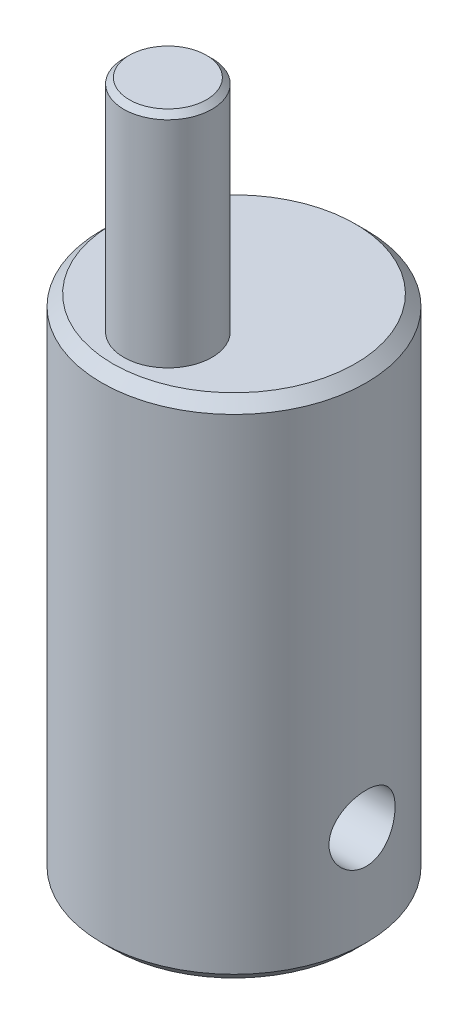
ISO-10303-21;
HEADER;
FILE_DESCRIPTION(('STEP AP214'),'2;1');
FILE_NAME('part.step','',(''),(''),'','','');
FILE_SCHEMA(('AUTOMOTIVE_DESIGN { 1 0 10303 214 1 1 1 1 }'));
ENDSEC;
DATA;
#1=APPLICATION_CONTEXT('core data for automotive mechanical design processes');
#2=APPLICATION_PROTOCOL_DEFINITION('international standard','automotive_design',2000,#1);
#3=PRODUCT_CONTEXT('',#1,'mechanical');
#4=PRODUCT('Part','Part','',(#3));
#5=PRODUCT_RELATED_PRODUCT_CATEGORY('part','',(#4));
#6=PRODUCT_DEFINITION_FORMATION('','',#4);
#7=PRODUCT_DEFINITION_CONTEXT('part definition',#1,'design');
#8=PRODUCT_DEFINITION('design','',#6,#7);
#9=PRODUCT_DEFINITION_SHAPE('','',#8);
#10=(LENGTH_UNIT() NAMED_UNIT(*) SI_UNIT(.MILLI.,.METRE.));
#11=(NAMED_UNIT(*) PLANE_ANGLE_UNIT() SI_UNIT($,.RADIAN.));
#12=(NAMED_UNIT(*) SI_UNIT($,.STERADIAN.) SOLID_ANGLE_UNIT());
#13=UNCERTAINTY_MEASURE_WITH_UNIT(LENGTH_MEASURE(1.E-05),#10,'distance_accuracy_value','');
#14=(GEOMETRIC_REPRESENTATION_CONTEXT(3) GLOBAL_UNCERTAINTY_ASSIGNED_CONTEXT((#13)) GLOBAL_UNIT_ASSIGNED_CONTEXT((#10,
#11,#12)) REPRESENTATION_CONTEXT('',''));
#15=CARTESIAN_POINT('',(0.,0.,0.));
#16=DIRECTION('',(0.,0.,1.));
#17=DIRECTION('',(1.,0.,0.));
#18=AXIS2_PLACEMENT_3D('',#15,#16,#17);
#19=CARTESIAN_POINT('',(0.,23.,0.));
#20=DIRECTION('',(0.,-1.,0.));
#21=DIRECTION('',(0.,0.,-1.));
#22=AXIS2_PLACEMENT_3D('',#19,#20,#21);
#23=CYLINDRICAL_SURFACE('',#22,6.);
#24=CARTESIAN_POINT('',(0.,0.5,0.));
#25=DIRECTION('',(0.,1.,0.));
#26=DIRECTION('',(0.,0.,1.));
#27=AXIS2_PLACEMENT_3D('',#24,#25,#26);
#28=CIRCLE('',#27,6.);
#29=CARTESIAN_POINT('',(0.,0.5,6.));
#30=VERTEX_POINT('',#29);
#31=EDGE_CURVE('E49',#30,#30,#28,.T.);
#32=ORIENTED_EDGE('',*,*,#31,.T.);
#33=EDGE_LOOP('',(#32));
#34=FACE_BOUND('',#33,.T.);
#35=CARTESIAN_POINT('',(0.,22.5,0.));
#36=DIRECTION('',(0.,1.,0.));
#37=DIRECTION('',(0.,0.,1.));
#38=AXIS2_PLACEMENT_3D('',#35,#36,#37);
#39=CIRCLE('',#38,6.);
#40=CARTESIAN_POINT('',(0.,22.5,6.));
#41=VERTEX_POINT('',#40);
#42=EDGE_CURVE('E53',#41,#41,#39,.F.);
#43=ORIENTED_EDGE('',*,*,#42,.T.);
#44=EDGE_LOOP('',(#43));
#45=FACE_BOUND('',#44,.T.);
#46=CARTESIAN_POINT('',(-6.,3.5,0.));
#47=CARTESIAN_POINT('',(-5.99999859868013,3.50000232573816,-0.0828760886697311));
#48=CARTESIAN_POINT('',(-5.99826578131828,3.50689155077379,-0.165778157830763));
#49=CARTESIAN_POINT('',(-5.99152113829892,3.534225151307,-0.329206323770533));
#50=CARTESIAN_POINT('',(-5.98650745419968,3.55467720953785,-0.409731046870739));
#51=CARTESIAN_POINT('',(-5.9737562633204,3.60843925346209,-0.566020872182577));
#52=CARTESIAN_POINT('',(-5.96602202842087,3.64173379871528,-0.641791563430003));
#53=CARTESIAN_POINT('',(-5.94865343807593,3.72018139004483,-0.786672131904427));
#54=CARTESIAN_POINT('',(-5.9390190185405,3.76533483611894,-0.855781784348759));
#55=CARTESIAN_POINT('',(-5.91867413591801,3.86720078965421,-0.98680192730092));
#56=CARTESIAN_POINT('',(-5.90794707148533,3.92411157495918,-1.04855569006107));
#57=CARTESIAN_POINT('',(-5.8867362011753,4.04745220490892,-1.1617489272033));
#58=CARTESIAN_POINT('',(-5.87625242288348,4.1138831229465,-1.21318723694913));
#59=CARTESIAN_POINT('',(-5.8565477569971,4.25559522673744,-1.30502654279903));
#60=CARTESIAN_POINT('',(-5.84734794470605,4.3309932308104,-1.34525221592536));
#61=CARTESIAN_POINT('',(-5.83149494812223,4.48774841165836,-1.41239690855053));
#62=CARTESIAN_POINT('',(-5.82484135672789,4.56910463332576,-1.43931805543933));
#63=CARTESIAN_POINT('',(-5.81500476717551,4.73374349820247,-1.47855483680429));
#64=CARTESIAN_POINT('',(-5.81175491075426,4.8169548960498,-1.49115226833334));
#65=CARTESIAN_POINT('',(-5.80889362537741,4.98436856901398,-1.50226177506785));
#66=CARTESIAN_POINT('',(-5.80928160448644,5.06857068069861,-1.50077614181798));
#67=CARTESIAN_POINT('',(-5.81359205496618,5.23341580774448,-1.48398652463928));
#68=CARTESIAN_POINT('',(-5.81742863001879,5.3140956214651,-1.46901834019052));
#69=CARTESIAN_POINT('',(-5.82806709676484,5.47176105091129,-1.42622418690311));
#70=CARTESIAN_POINT('',(-5.83486919970696,5.54874640302898,-1.39839730206942));
#71=CARTESIAN_POINT('',(-5.85075113904187,5.69773801625207,-1.33038947793715));
#72=CARTESIAN_POINT('',(-5.85985327469421,5.76968617178955,-1.29008666723291));
#73=CARTESIAN_POINT('',(-5.87929710846386,5.90591870975684,-1.19835627601495));
#74=CARTESIAN_POINT('',(-5.88963902334735,5.97020174806726,-1.14692674880884));
#75=CARTESIAN_POINT('',(-5.91075880539781,6.0912036156944,-1.03266342468122));
#76=CARTESIAN_POINT('',(-5.92154069477971,6.14765449006135,-0.96954625816586));
#77=CARTESIAN_POINT('',(-5.94205965578786,6.2492212424639,-0.8346119175037));
#78=CARTESIAN_POINT('',(-5.95179669549415,6.29433677426357,-0.762794477707944));
#79=CARTESIAN_POINT('',(-5.96917732094183,6.37205058622439,-0.612115888681392));
#80=CARTESIAN_POINT('',(-5.97681360127725,6.40460534025443,-0.533231393208624));
#81=CARTESIAN_POINT('',(-5.98907916991419,6.45591730570957,-0.370876008142883));
#82=CARTESIAN_POINT('',(-5.99370903339281,6.47467715641814,-0.287405999150485));
#83=CARTESIAN_POINT('',(-5.99935499271375,6.49745756555884,-0.120539970390027));
#84=CARTESIAN_POINT('',(-6.00046053508279,6.5018430260753,-0.0371967199882103));
#85=CARTESIAN_POINT('',(-5.99918804814451,6.49675099794451,0.129032874801507));
#86=CARTESIAN_POINT('',(-5.99681033241847,6.48727475720087,0.211919259644594));
#87=CARTESIAN_POINT('',(-5.98889581127357,6.45502909160862,0.373614268776491));
#88=CARTESIAN_POINT('',(-5.98340634185811,6.43245873652301,0.452465118968754));
#89=CARTESIAN_POINT('',(-5.96988706634134,6.37489291597155,0.605257292452511));
#90=CARTESIAN_POINT('',(-5.96185700369892,6.33989619568683,0.679198119032634));
#91=CARTESIAN_POINT('',(-5.94393307926311,6.25776387112527,0.821523134429847));
#92=CARTESIAN_POINT('',(-5.93400867366932,6.21042388760324,0.88978544183583));
#93=CARTESIAN_POINT('',(-5.91344509187419,6.10521009120303,1.01752661364325));
#94=CARTESIAN_POINT('',(-5.90280579251705,6.04733446038309,1.07700395897301));
#95=CARTESIAN_POINT('',(-5.88168956960771,5.92099803915554,1.18699056807273));
#96=CARTESIAN_POINT('',(-5.87122304187281,5.85231229699758,1.23724386762203));
#97=CARTESIAN_POINT('',(-5.85192878377239,5.70726736553428,1.3255107590127));
#98=CARTESIAN_POINT('',(-5.84310098067026,5.63090851704025,1.36352489415794));
#99=CARTESIAN_POINT('',(-5.82818094734665,5.47309427758692,1.42595142060929));
#100=CARTESIAN_POINT('',(-5.82207255291906,5.39167237165599,1.45044439665406));
#101=CARTESIAN_POINT('',(-5.81326744090184,5.22569036211089,1.48534565995378));
#102=CARTESIAN_POINT('',(-5.81056997719936,5.14113094896751,1.49575702747866));
#103=CARTESIAN_POINT('',(-5.80894901203957,4.9738789761448,1.50203859033399));
#104=CARTESIAN_POINT('',(-5.80991932728264,4.89120256487527,1.49831789778012));
#105=CARTESIAN_POINT('',(-5.81527909007843,4.72769611133202,1.47737727831287));
#106=CARTESIAN_POINT('',(-5.81966846891857,4.64686603198635,1.46015762268677));
#107=CARTESIAN_POINT('',(-5.83131260682722,4.48979154093459,1.41293131944279));
#108=CARTESIAN_POINT('',(-5.83855015236309,4.41352269475979,1.38300140468038));
#109=CARTESIAN_POINT('',(-5.85507755724829,4.26703461728631,1.31126491360507));
#110=CARTESIAN_POINT('',(-5.86436770120773,4.19681622681309,1.26945669003419));
#111=CARTESIAN_POINT('',(-5.88425634263512,4.06244537099798,1.17386774863714));
#112=CARTESIAN_POINT('',(-5.89488264831757,3.99849892657604,1.11980316291226));
#113=CARTESIAN_POINT('',(-5.91608027246286,3.88045295520459,1.00178937118974));
#114=CARTESIAN_POINT('',(-5.9266515772706,3.82635576988703,0.937837821261146));
#115=CARTESIAN_POINT('',(-5.94677655647663,3.72858869143539,0.800467586702591));
#116=CARTESIAN_POINT('',(-5.95630833365868,3.68512538632842,0.726898422316388));
#117=CARTESIAN_POINT('',(-5.97304924975118,3.61125253705947,0.573266059510477));
#118=CARTESIAN_POINT('',(-5.98026005199781,3.58083363935146,0.49320756343674));
#119=CARTESIAN_POINT('',(-5.99048059565542,3.53842816967035,0.344410253243472));
#120=CARTESIAN_POINT('',(-5.99402585052691,3.52404875694657,0.276380170908069));
#121=CARTESIAN_POINT('',(-5.99878605231948,3.50483405637806,0.138906071536283));
#122=CARTESIAN_POINT('',(-6.00000117450894,3.4999980506947,0.0694621612426164));
#123=CARTESIAN_POINT('',(-6.,3.5,0.));
#124=B_SPLINE_CURVE_WITH_KNOTS('',3,(#46,#47,#48,#49,#50,#51,#52,#53,#54,#55,#56,#57,#58,#59,
#60,#61,#62,#63,#64,#65,#66,#67,#68,#69,#70,#71,#72,#73,#74,#75,#76,#77,#78,#79,#80,#81,#82,#83,
#84,#85,#86,#87,#88,#89,#90,#91,#92,#93,#94,#95,#96,#97,#98,#99,#100,#101,#102,#103,#104,#105,
#106,#107,#108,#109,#110,#111,#112,#113,#114,#115,#116,#117,#118,#119,#120,#121,#122,#123),
.UNSPECIFIED.,.T.,.F.,(4,2,2,2,2,2,2,2,2,2,2,2,2,2,2,2,2,2,2,2,2,2,2,2,2,2,2,2,2,2,2,2,2,2,2,2,
2,2,4),(0.,0.24837371247189,0.4968882377639,0.745104902286106,0.993329940169329,
1.24614435437139,1.49898729580062,1.75558647545807,2.01214461169368,2.2635629509943,
2.51494038112697,2.76022497007018,3.00552703466038,3.25330527873879,3.50112690836163,
3.75601500969019,4.01091089558247,4.26668229009114,4.52240473688643,4.77158308949276,
5.02073901112743,5.26620274514037,5.5116912732229,5.76153587565352,6.01142363008019,
6.26744509204476,6.52345518749508,6.77792254614036,7.03233423252407,7.27943780398612,
7.52653640956034,7.77216400559447,8.01782568136901,8.2698957640991,8.52202569770417,
8.77872185499588,9.0352336382135,9.24342242942149,9.45159556043039),.UNSPECIFIED.);
#125=CARTESIAN_POINT('',(-6.,3.5,0.));
#126=VERTEX_POINT('',#125);
#127=EDGE_CURVE('E64',#126,#126,#124,.T.);
#128=ORIENTED_EDGE('',*,*,#127,.T.);
#129=EDGE_LOOP('',(#128));
#130=FACE_BOUND('',#129,.T.);
#131=CARTESIAN_POINT('',(5.80947501931113,5.,-1.5));
#132=CARTESIAN_POINT('',(5.80947660051185,4.91716954944523,-1.49999764715507));
#133=CARTESIAN_POINT('',(5.81126583608348,4.8343130607932,-1.49311574729838));
#134=CARTESIAN_POINT('',(5.81821117195949,4.67097945309558,-1.46581387527848));
#135=CARTESIAN_POINT('',(5.82336923173088,4.590503747319,-1.44538602404532));
#136=CARTESIAN_POINT('',(5.8364323475758,4.43431787708778,-1.39169471977917));
#137=CARTESIAN_POINT('',(5.84433385614245,4.3586017067686,-1.35844783671268));
#138=CARTESIAN_POINT('',(5.86198915217285,4.21381348847605,-1.28011268475685));
#139=CARTESIAN_POINT('',(5.87174301827101,4.14474172275187,-1.23502391313642));
#140=CARTESIAN_POINT('',(5.89224429813367,4.01368301284268,-1.13322505638713));
#141=CARTESIAN_POINT('',(5.90300758573818,3.95186383978997,-1.07630213262243));
#142=CARTESIAN_POINT('',(5.92417725309179,3.83854316338379,-0.952909238460399));
#143=CARTESIAN_POINT('',(5.93458359939834,3.78704262462695,-0.886438376508185));
#144=CARTESIAN_POINT('',(5.95404249312349,3.69513471942123,-0.744687120647373));
#145=CARTESIAN_POINT('',(5.96307412440355,3.65489216710312,-0.669296745717072));
#146=CARTESIAN_POINT('',(5.9785848715559,3.58771421350815,-0.512557910575657));
#147=CARTESIAN_POINT('',(5.98506436400607,3.56077684885069,-0.431210331475164));
#148=CARTESIAN_POINT('',(5.99462855308908,3.52151129925285,-0.266615255252497));
#149=CARTESIAN_POINT('',(5.99777936306589,3.50889821340405,-0.183439631729386));
#150=CARTESIAN_POINT('',(6.00056156464379,3.49774497243467,-0.0160972915576618));
#151=CARTESIAN_POINT('',(6.00019347658022,3.49920273667424,0.068069276722841));
#152=CARTESIAN_POINT('',(5.99602856972121,3.51594491015009,0.233028370758581));
#153=CARTESIAN_POINT('',(5.99230801404524,3.53092179503231,0.313854323401601));
#154=CARTESIAN_POINT('',(5.98194501914912,3.5737827620291,0.47180737112053));
#155=CARTESIAN_POINT('',(5.97530242439065,3.60166753122645,0.548934269055657));
#156=CARTESIAN_POINT('',(5.95972505820537,3.66980154241224,0.69811005525271));
#157=CARTESIAN_POINT('',(5.95077011817032,3.71016022679705,0.770106764649757));
#158=CARTESIAN_POINT('',(5.9315394228579,3.80201340746976,0.906413433510734));
#159=CARTESIAN_POINT('',(5.92126343791494,3.85350984113637,0.970722052628259));
#160=CARTESIAN_POINT('',(5.90018228261712,3.96782524518943,1.09166105262743));
#161=CARTESIAN_POINT('',(5.88937031715551,4.03091293540867,1.1480365186128));
#162=CARTESIAN_POINT('',(5.86869026110024,4.16575998412415,1.24946456394453));
#163=CARTESIAN_POINT('',(5.85882221463582,4.2375197476946,1.29451661406903));
#164=CARTESIAN_POINT('',(5.84112298098989,4.38817402048938,1.3721821935339));
#165=CARTESIAN_POINT('',(5.83330190235432,4.46710143818792,1.40473435045574));
#166=CARTESIAN_POINT('',(5.82071184083974,4.62955128084587,1.45602843095451));
#167=CARTESIAN_POINT('',(5.81594220486131,4.71307271838988,1.47477330982937));
#168=CARTESIAN_POINT('',(5.81013213623485,4.87997570091387,1.49749778319911));
#169=CARTESIAN_POINT('',(5.80899653456189,4.96330267599778,1.50185428435178));
#170=CARTESIAN_POINT('',(5.81032406088624,5.1294931619469,1.49671019430933));
#171=CARTESIAN_POINT('',(5.8127868576076,5.21235671477075,1.48721087870928));
#172=CARTESIAN_POINT('',(5.82094249172736,5.37386855897283,1.4549552783626));
#173=CARTESIAN_POINT('',(5.82658182140625,5.45256363594251,1.43241844096905));
#174=CARTESIAN_POINT('',(5.84040430962578,5.60505887471101,1.37497084900237));
#175=CARTESIAN_POINT('',(5.84858776949168,5.6788584554332,1.34005862862753));
#176=CARTESIAN_POINT('',(5.86677682255958,5.82106476672041,1.25806240076193));
#177=CARTESIAN_POINT('',(5.87681501163985,5.88933730402586,1.21075305230138));
#178=CARTESIAN_POINT('',(5.8975024984303,6.01711301768081,1.10559043940168));
#179=CARTESIAN_POINT('',(5.90815189637082,6.07661474999004,1.04773544220816));
#180=CARTESIAN_POINT('',(5.92918441818964,6.18668662554257,0.921394081477089));
#181=CARTESIAN_POINT('',(5.93955421237101,6.23699603752929,0.852677928797389));
#182=CARTESIAN_POINT('',(5.95858329968241,6.32536152017075,0.707554024042013));
#183=CARTESIAN_POINT('',(5.96724268202376,6.36341822996492,0.631146673436387));
#184=CARTESIAN_POINT('',(5.98182069442989,6.42586762071676,0.473337302596635));
#185=CARTESIAN_POINT('',(5.98775898013446,6.45035857062744,0.391976071541822));
#186=CARTESIAN_POINT('',(5.99631176037473,6.48527620076505,0.226124640478212));
#187=CARTESIAN_POINT('',(5.99892689636045,6.49570559524343,0.141635047561865));
#188=CARTESIAN_POINT('',(6.00051254113217,6.5020513843633,-0.0256252896649896));
#189=CARTESIAN_POINT('',(5.99957968320012,6.49835256364309,-0.10838074044905));
#190=CARTESIAN_POINT('',(5.99438844686135,6.4774282590585,-0.272051244622109));
#191=CARTESIAN_POINT('',(5.99013016735643,6.46020317748035,-0.35296635267133));
#192=CARTESIAN_POINT('',(5.97878149280944,6.41292167034361,-0.510256553467225));
#193=CARTESIAN_POINT('',(5.97170646753999,6.38293482002806,-0.586653741871529));
#194=CARTESIAN_POINT('',(5.95546933370076,6.31104413147101,-0.733375579562203));
#195=CARTESIAN_POINT('',(5.94630696206604,6.26913879099565,-0.803699461897578));
#196=CARTESIAN_POINT('',(5.92660874521999,6.17342714900439,-0.93810289263585));
#197=CARTESIAN_POINT('',(5.91604525418417,6.11935978563893,-1.00199248245088));
#198=CARTESIAN_POINT('',(5.89485973579863,6.0013657220393,-1.11992253040688));
#199=CARTESIAN_POINT('',(5.88423769428834,5.93743652585314,-1.17396048760228));
#200=CARTESIAN_POINT('',(5.86391213790822,5.800097878698,-1.27164303971884));
#201=CARTESIAN_POINT('',(5.85422945594827,5.72653381488106,-1.31507492916982));
#202=CARTESIAN_POINT('',(5.83715933325924,5.57291676511595,-1.3888903449235));
#203=CARTESIAN_POINT('',(5.82977022370054,5.49286855083989,-1.41928336463958));
#204=CARTESIAN_POINT('',(5.81927863109675,5.34413448225992,-1.46163379284816));
#205=CARTESIAN_POINT('',(5.8156299450082,5.27616025342421,-1.47598975589307));
#206=CARTESIAN_POINT('',(5.81072757878358,5.13879669650005,-1.4951734388599));
#207=CARTESIAN_POINT('',(5.80947369434945,5.06940748963241,-1.50000197155828));
#208=CARTESIAN_POINT('',(5.80947501931113,5.,-1.5));
#209=B_SPLINE_CURVE_WITH_KNOTS('',3,(#131,#132,#133,#134,#135,#136,#137,#138,#139,#140,#141,
#142,#143,#144,#145,#146,#147,#148,#149,#150,#151,#152,#153,#154,#155,#156,#157,#158,#159,#160,
#161,#162,#163,#164,#165,#166,#167,#168,#169,#170,#171,#172,#173,#174,#175,#176,#177,#178,#179,
#180,#181,#182,#183,#184,#185,#186,#187,#188,#189,#190,#191,#192,#193,#194,#195,#196,#197,#198,
#199,#200,#201,#202,#203,#204,#205,#206,#207,#208),.UNSPECIFIED.,.T.,.F.,(4,2,2,2,2,2,2,2,2,2,2,
2,2,2,2,2,2,2,2,2,2,2,2,2,2,2,2,2,2,2,2,2,2,2,2,2,2,2,4),(0.,0.248236465041681,0.4966174448572,
0.744678436299612,0.99274996053287,1.24574372515786,1.4987611288792,1.75530897838752,
2.01181895908255,2.26313250597208,2.51440889199612,2.76010957613368,3.00582334034872,
3.25375724552667,3.50173431281348,3.75642279943147,4.01112318719881,4.26705859205042,
4.52293920077729,4.7720614485703,5.02116076310281,5.26618443005524,5.5112371285285,
5.76109707515494,6.01099811331027,6.26715198579191,6.52329249431732,6.77755243684158,
7.03176329345423,7.27910067676474,7.52643070426189,7.77242925935827,8.01845883442843,
8.27038257949243,8.52237018939306,8.77905886370806,9.03556032819972,9.24358696306398,
9.45159585059713),.UNSPECIFIED.);
#210=CARTESIAN_POINT('',(5.80947501931113,5.,-1.5));
#211=VERTEX_POINT('',#210);
#212=EDGE_CURVE('E72',#211,#211,#209,.T.);
#213=ORIENTED_EDGE('',*,*,#212,.T.);
#214=EDGE_LOOP('',(#213));
#215=FACE_BOUND('',#214,.T.);
#216=ADVANCED_FACE('F37',(#34,#45,#130,#215),#23,.T.);
#217=CARTESIAN_POINT('',(0.,23.,0.));
#218=DIRECTION('',(0.,1.,0.));
#219=DIRECTION('',(0.,0.,1.));
#220=AXIS2_PLACEMENT_3D('',#217,#218,#219);
#221=PLANE('',#220);
#222=CARTESIAN_POINT('',(0.,23.,0.));
#223=DIRECTION('',(0.,1.,0.));
#224=DIRECTION('',(0.,0.,1.));
#225=AXIS2_PLACEMENT_3D('',#222,#223,#224);
#226=CIRCLE('',#225,5.49999999999999);
#227=CARTESIAN_POINT('',(0.,23.,5.49999999999999));
#228=VERTEX_POINT('',#227);
#229=EDGE_CURVE('E10',#228,#228,#226,.T.);
#230=ORIENTED_EDGE('',*,*,#229,.T.);
#231=EDGE_LOOP('',(#230));
#232=FACE_BOUND('',#231,.T.);
#233=CARTESIAN_POINT('',(0.,23.,3.));
#234=DIRECTION('',(0.,1.,0.));
#235=DIRECTION('',(0.,0.,1.));
#236=AXIS2_PLACEMENT_3D('',#233,#234,#235);
#237=CIRCLE('',#236,2.);
#238=CARTESIAN_POINT('',(0.,23.,5.));
#239=VERTEX_POINT('',#238);
#240=EDGE_CURVE('E113',#239,#239,#237,.T.);
#241=ORIENTED_EDGE('',*,*,#240,.F.);
#242=EDGE_LOOP('',(#241));
#243=FACE_BOUND('',#242,.T.);
#244=ADVANCED_FACE('F96',(#232,#243),#221,.T.);
#245=CARTESIAN_POINT('',(0.,0.,0.));
#246=DIRECTION('',(0.,1.,0.));
#247=DIRECTION('',(0.,0.,1.));
#248=AXIS2_PLACEMENT_3D('',#245,#246,#247);
#249=PLANE('',#248);
#250=CARTESIAN_POINT('',(0.,0.,0.));
#251=DIRECTION('',(0.,1.,0.));
#252=DIRECTION('',(0.,0.,1.));
#253=AXIS2_PLACEMENT_3D('',#250,#251,#252);
#254=CIRCLE('',#253,5.5);
#255=CARTESIAN_POINT('',(0.,0.,5.5));
#256=VERTEX_POINT('',#255);
#257=EDGE_CURVE('E45',#256,#256,#254,.F.);
#258=ORIENTED_EDGE('',*,*,#257,.T.);
#259=EDGE_LOOP('',(#258));
#260=FACE_BOUND('',#259,.T.);
#261=ADVANCED_FACE('F94',(#260),#249,.F.);
#262=CARTESIAN_POINT('',(0.,33.,3.));
#263=DIRECTION('',(0.,-1.,0.));
#264=DIRECTION('',(0.,0.,-1.));
#265=AXIS2_PLACEMENT_3D('',#262,#263,#264);
#266=CYLINDRICAL_SURFACE('',#265,2.);
#267=CARTESIAN_POINT('',(0.,32.75,3.));
#268=DIRECTION('',(0.,1.,0.));
#269=DIRECTION('',(0.,0.,1.));
#270=AXIS2_PLACEMENT_3D('',#267,#268,#269);
#271=CIRCLE('',#270,2.);
#272=CARTESIAN_POINT('',(0.,32.75,5.));
#273=VERTEX_POINT('',#272);
#274=EDGE_CURVE('E58',#273,#273,#271,.F.);
#275=ORIENTED_EDGE('',*,*,#274,.T.);
#276=EDGE_LOOP('',(#275));
#277=FACE_BOUND('',#276,.T.);
#278=ORIENTED_EDGE('',*,*,#240,.T.);
#279=EDGE_LOOP('',(#278));
#280=FACE_BOUND('',#279,.T.);
#281=ADVANCED_FACE('F90',(#277,#280),#266,.T.);
#282=CARTESIAN_POINT('',(0.,33.,3.));
#283=DIRECTION('',(0.,1.,0.));
#284=DIRECTION('',(0.,0.,1.));
#285=AXIS2_PLACEMENT_3D('',#282,#283,#284);
#286=PLANE('',#285);
#287=CARTESIAN_POINT('',(0.,33.,3.));
#288=DIRECTION('',(0.,1.,0.));
#289=DIRECTION('',(0.,0.,1.));
#290=AXIS2_PLACEMENT_3D('',#287,#288,#289);
#291=CIRCLE('',#290,1.75000000000001);
#292=CARTESIAN_POINT('',(0.,33.,4.75000000000001));
#293=VERTEX_POINT('',#292);
#294=EDGE_CURVE('E61',#293,#293,#291,.T.);
#295=ORIENTED_EDGE('',*,*,#294,.T.);
#296=EDGE_LOOP('',(#295));
#297=FACE_BOUND('',#296,.T.);
#298=ADVANCED_FACE('F85',(#297),#286,.T.);
#299=CARTESIAN_POINT('',(-6.,5.,0.));
#300=DIRECTION('',(1.,0.,0.));
#301=DIRECTION('',(0.,0.,-1.));
#302=AXIS2_PLACEMENT_3D('',#299,#300,#301);
#303=CYLINDRICAL_SURFACE('',#302,1.5);
#304=ORIENTED_EDGE('',*,*,#212,.F.);
#305=EDGE_LOOP('',(#304));
#306=FACE_BOUND('',#305,.T.);
#307=ORIENTED_EDGE('',*,*,#127,.F.);
#308=EDGE_LOOP('',(#307));
#309=FACE_BOUND('',#308,.T.);
#310=ADVANCED_FACE('F80',(#306,#309),#303,.F.);
#311=CARTESIAN_POINT('',(0.,33.,3.));
#312=DIRECTION('',(0.,-1.,0.));
#313=DIRECTION('',(0.,0.,-1.));
#314=AXIS2_PLACEMENT_3D('',#311,#312,#313);
#315=CONICAL_SURFACE('',#314,1.75000000000001,0.785398163397438);
#316=ORIENTED_EDGE('',*,*,#274,.F.);
#317=EDGE_LOOP('',(#316));
#318=FACE_BOUND('',#317,.T.);
#319=ORIENTED_EDGE('',*,*,#294,.F.);
#320=EDGE_LOOP('',(#319));
#321=FACE_BOUND('',#320,.T.);
#322=ADVANCED_FACE('F84',(#318,#321),#315,.T.);
#323=CARTESIAN_POINT('',(0.,0.5,0.));
#324=DIRECTION('',(0.,1.,0.));
#325=DIRECTION('',(0.,0.,1.));
#326=AXIS2_PLACEMENT_3D('',#323,#324,#325);
#327=CONICAL_SURFACE('',#326,6.,0.785398163397454);
#328=ORIENTED_EDGE('',*,*,#257,.F.);
#329=EDGE_LOOP('',(#328));
#330=FACE_BOUND('',#329,.T.);
#331=ORIENTED_EDGE('',*,*,#31,.F.);
#332=EDGE_LOOP('',(#331));
#333=FACE_BOUND('',#332,.T.);
#334=ADVANCED_FACE('F122',(#330,#333),#327,.T.);
#335=CARTESIAN_POINT('',(0.,23.,0.));
#336=DIRECTION('',(0.,-1.,0.));
#337=DIRECTION('',(0.,0.,-1.));
#338=AXIS2_PLACEMENT_3D('',#335,#336,#337);
#339=CONICAL_SURFACE('',#338,5.49999999999999,0.785398163397447);
#340=ORIENTED_EDGE('',*,*,#42,.F.);
#341=EDGE_LOOP('',(#340));
#342=FACE_BOUND('',#341,.T.);
#343=ORIENTED_EDGE('',*,*,#229,.F.);
#344=EDGE_LOOP('',(#343));
#345=FACE_BOUND('',#344,.T.);
#346=ADVANCED_FACE('F40',(#342,#345),#339,.T.);
#347=CLOSED_SHELL('',(#216,#244,#261,#281,#298,#310,#322,#334,#346));
#348=MANIFOLD_SOLID_BREP('B2',#347);
#349=ADVANCED_BREP_SHAPE_REPRESENTATION('',(#18,#348),#14);
#350=SHAPE_DEFINITION_REPRESENTATION(#9,#349);
ENDSEC;
END-ISO-10303-21;
